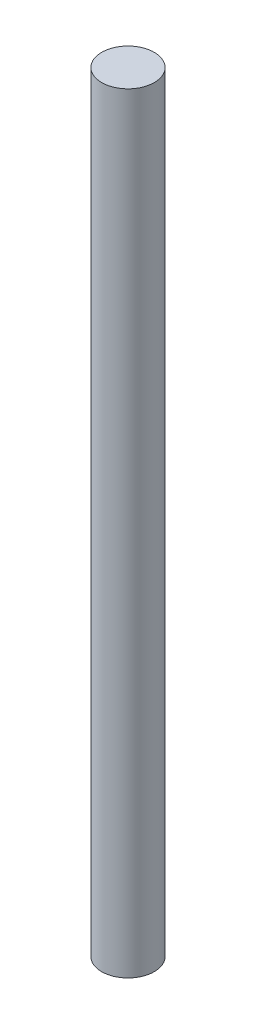
ISO-10303-21;
HEADER;
FILE_DESCRIPTION(('STEP AP214'),'2;1');
FILE_NAME('part.step','',(''),(''),'','','');
FILE_SCHEMA(('AUTOMOTIVE_DESIGN { 1 0 10303 214 1 1 1 1 }'));
ENDSEC;
DATA;
#1=APPLICATION_CONTEXT('core data for automotive mechanical design processes');
#2=APPLICATION_PROTOCOL_DEFINITION('international standard','automotive_design',2000,#1);
#3=PRODUCT_CONTEXT('',#1,'mechanical');
#4=PRODUCT('Part','Part','',(#3));
#5=PRODUCT_RELATED_PRODUCT_CATEGORY('part','',(#4));
#6=PRODUCT_DEFINITION_FORMATION('','',#4);
#7=PRODUCT_DEFINITION_CONTEXT('part definition',#1,'design');
#8=PRODUCT_DEFINITION('design','',#6,#7);
#9=PRODUCT_DEFINITION_SHAPE('','',#8);
#10=(LENGTH_UNIT() NAMED_UNIT(*) SI_UNIT(.MILLI.,.METRE.));
#11=(NAMED_UNIT(*) PLANE_ANGLE_UNIT() SI_UNIT($,.RADIAN.));
#12=(NAMED_UNIT(*) SI_UNIT($,.STERADIAN.) SOLID_ANGLE_UNIT());
#13=UNCERTAINTY_MEASURE_WITH_UNIT(LENGTH_MEASURE(1.E-05),#10,'distance_accuracy_value','');
#14=(GEOMETRIC_REPRESENTATION_CONTEXT(3) GLOBAL_UNCERTAINTY_ASSIGNED_CONTEXT((#13)) GLOBAL_UNIT_ASSIGNED_CONTEXT((#10,
#11,#12)) REPRESENTATION_CONTEXT('',''));
#15=CARTESIAN_POINT('',(0.,0.,0.));
#16=DIRECTION('',(0.,0.,1.));
#17=DIRECTION('',(1.,0.,0.));
#18=AXIS2_PLACEMENT_3D('',#15,#16,#17);
#19=CARTESIAN_POINT('',(0.,22.,0.));
#20=DIRECTION('',(0.,-1.,0.));
#21=DIRECTION('',(0.,0.,-1.));
#22=AXIS2_PLACEMENT_3D('',#19,#20,#21);
#23=CYLINDRICAL_SURFACE('',#22,0.75);
#24=CARTESIAN_POINT('',(0.,22.,0.));
#25=DIRECTION('',(0.,1.,0.));
#26=DIRECTION('',(0.,0.,1.));
#27=AXIS2_PLACEMENT_3D('',#24,#25,#26);
#28=CIRCLE('',#27,0.75);
#29=CARTESIAN_POINT('',(0.,22.,0.75));
#30=VERTEX_POINT('',#29);
#31=EDGE_CURVE('E10',#30,#30,#28,.T.);
#32=ORIENTED_EDGE('',*,*,#31,.F.);
#33=EDGE_LOOP('',(#32));
#34=FACE_BOUND('',#33,.T.);
#35=CARTESIAN_POINT('',(0.,0.,0.));
#36=DIRECTION('',(0.,1.,0.));
#37=DIRECTION('',(0.,0.,1.));
#38=AXIS2_PLACEMENT_3D('',#35,#36,#37);
#39=CIRCLE('',#38,0.75);
#40=CARTESIAN_POINT('',(0.,0.,0.75));
#41=VERTEX_POINT('',#40);
#42=EDGE_CURVE('E38',#41,#41,#39,.T.);
#43=ORIENTED_EDGE('',*,*,#42,.T.);
#44=EDGE_LOOP('',(#43));
#45=FACE_BOUND('',#44,.T.);
#46=ADVANCED_FACE('F35',(#34,#45),#23,.T.);
#47=CARTESIAN_POINT('',(0.,22.,0.));
#48=DIRECTION('',(0.,1.,0.));
#49=DIRECTION('',(0.,0.,1.));
#50=AXIS2_PLACEMENT_3D('',#47,#48,#49);
#51=PLANE('',#50);
#52=ORIENTED_EDGE('',*,*,#31,.T.);
#53=EDGE_LOOP('',(#52));
#54=FACE_BOUND('',#53,.T.);
#55=ADVANCED_FACE('F50',(#54),#51,.T.);
#56=CARTESIAN_POINT('',(0.,0.,0.));
#57=DIRECTION('',(0.,1.,0.));
#58=DIRECTION('',(0.,0.,1.));
#59=AXIS2_PLACEMENT_3D('',#56,#57,#58);
#60=PLANE('',#59);
#61=ORIENTED_EDGE('',*,*,#42,.F.);
#62=EDGE_LOOP('',(#61));
#63=FACE_BOUND('',#62,.T.);
#64=ADVANCED_FACE('F48',(#63),#60,.F.);
#65=CLOSED_SHELL('',(#46,#55,#64));
#66=MANIFOLD_SOLID_BREP('B2',#65);
#67=ADVANCED_BREP_SHAPE_REPRESENTATION('',(#18,#66),#14);
#68=SHAPE_DEFINITION_REPRESENTATION(#9,#67);
ENDSEC;
END-ISO-10303-21;
